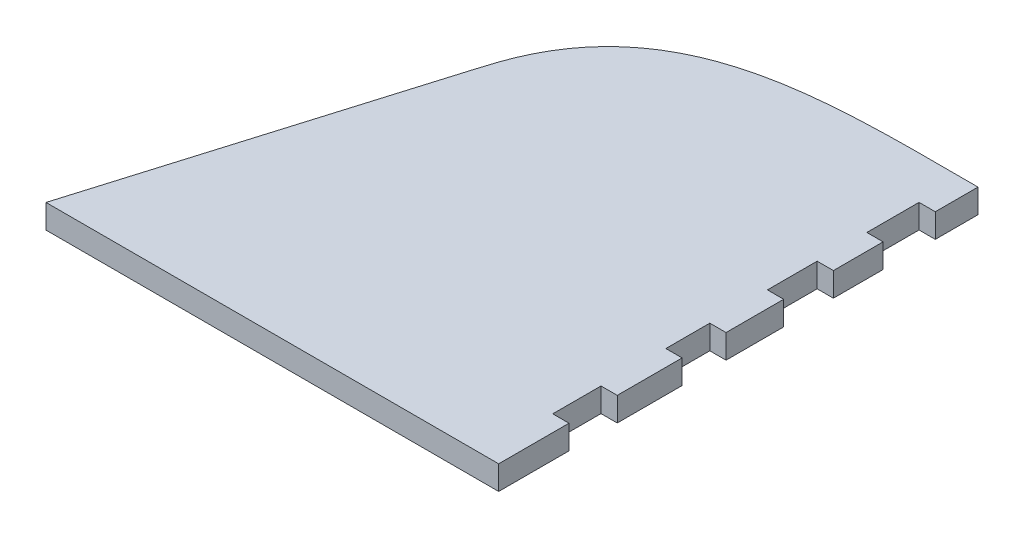
ISO-10303-21;
HEADER;
FILE_DESCRIPTION(('STEP AP214'),'2;1');
FILE_NAME('part.step','',(''),(''),'','','');
FILE_SCHEMA(('AUTOMOTIVE_DESIGN { 1 0 10303 214 1 1 1 1 }'));
ENDSEC;
DATA;
#1=APPLICATION_CONTEXT('core data for automotive mechanical design processes');
#2=APPLICATION_PROTOCOL_DEFINITION('international standard','automotive_design',2000,#1);
#3=PRODUCT_CONTEXT('',#1,'mechanical');
#4=PRODUCT('Part','Part','',(#3));
#5=PRODUCT_RELATED_PRODUCT_CATEGORY('part','',(#4));
#6=PRODUCT_DEFINITION_FORMATION('','',#4);
#7=PRODUCT_DEFINITION_CONTEXT('part definition',#1,'design');
#8=PRODUCT_DEFINITION('design','',#6,#7);
#9=PRODUCT_DEFINITION_SHAPE('','',#8);
#10=(LENGTH_UNIT() NAMED_UNIT(*) SI_UNIT(.MILLI.,.METRE.));
#11=(NAMED_UNIT(*) PLANE_ANGLE_UNIT() SI_UNIT($,.RADIAN.));
#12=(NAMED_UNIT(*) SI_UNIT($,.STERADIAN.) SOLID_ANGLE_UNIT());
#13=UNCERTAINTY_MEASURE_WITH_UNIT(LENGTH_MEASURE(1.E-05),#10,'distance_accuracy_value','');
#14=(GEOMETRIC_REPRESENTATION_CONTEXT(3) GLOBAL_UNCERTAINTY_ASSIGNED_CONTEXT((#13)) GLOBAL_UNIT_ASSIGNED_CONTEXT((#10,
#11,#12)) REPRESENTATION_CONTEXT('',''));
#15=CARTESIAN_POINT('',(0.,0.,0.));
#16=DIRECTION('',(0.,0.,1.));
#17=DIRECTION('',(1.,0.,0.));
#18=AXIS2_PLACEMENT_3D('',#15,#16,#17);
#19=CARTESIAN_POINT('',(107.95,5.715,-58.0476301724045));
#20=DIRECTION('',(1.,0.,0.));
#21=DIRECTION('',(0.,0.,-1.));
#22=AXIS2_PLACEMENT_3D('',#19,#20,#21);
#23=PLANE('',#22);
#24=DIRECTION('',(0.,0.,1.));
#25=VECTOR('',#24,1.);
#26=CARTESIAN_POINT('',(107.95,0.,-58.0476301724045));
#27=LINE('',#26,#25);
#28=CARTESIAN_POINT('',(107.95,0.,-114.3));
#29=VERTEX_POINT('',#28);
#30=CARTESIAN_POINT('',(107.95,0.,-104.11377720999));
#31=VERTEX_POINT('',#30);
#32=EDGE_CURVE('E204',#29,#31,#27,.T.);
#33=ORIENTED_EDGE('',*,*,#32,.F.);
#34=DIRECTION('',(0.,-1.,0.));
#35=VECTOR('',#34,1.);
#36=CARTESIAN_POINT('',(107.95,5.715,-114.3));
#37=LINE('',#36,#35);
#38=CARTESIAN_POINT('',(107.95,5.715,-114.3));
#39=VERTEX_POINT('',#38);
#40=EDGE_CURVE('E11',#39,#29,#37,.T.);
#41=ORIENTED_EDGE('',*,*,#40,.F.);
#42=DIRECTION('',(0.,0.,1.));
#43=VECTOR('',#42,1.);
#44=CARTESIAN_POINT('',(107.95,5.715,-58.0476301724045));
#45=LINE('',#44,#43);
#46=CARTESIAN_POINT('',(107.95,5.715,-104.11377720999));
#47=VERTEX_POINT('',#46);
#48=EDGE_CURVE('E260',#39,#47,#45,.T.);
#49=ORIENTED_EDGE('',*,*,#48,.T.);
#50=DIRECTION('',(0.,-1.,0.));
#51=VECTOR('',#50,1.);
#52=CARTESIAN_POINT('',(107.95,5.715,-104.11377720999));
#53=LINE('',#52,#51);
#54=EDGE_CURVE('E48',#47,#31,#53,.T.);
#55=ORIENTED_EDGE('',*,*,#54,.T.);
#56=EDGE_LOOP('',(#33,#41,#49,#55));
#57=FACE_BOUND('',#56,.T.);
#58=ADVANCED_FACE('F31',(#57),#23,.T.);
#59=CARTESIAN_POINT('',(-69.4727218626998,5.715,-114.3));
#60=DIRECTION('',(0.,0.,1.));
#61=DIRECTION('',(1.,0.,0.));
#62=AXIS2_PLACEMENT_3D('',#59,#60,#61);
#63=PLANE('',#62);
#64=DIRECTION('',(-1.,0.,0.));
#65=VECTOR('',#64,1.);
#66=CARTESIAN_POINT('',(-69.4727218626998,0.,-114.3));
#67=LINE('',#66,#65);
#68=CARTESIAN_POINT('',(92.7826361666683,0.,-114.299999999371));
#69=VERTEX_POINT('',#68);
#70=EDGE_CURVE('E206',#29,#69,#67,.T.);
#71=ORIENTED_EDGE('',*,*,#70,.T.);
#72=DIRECTION('',(0.,-1.,0.));
#73=VECTOR('',#72,1.);
#74=CARTESIAN_POINT('',(92.7826361666683,5.715,-114.299999999371));
#75=LINE('',#74,#73);
#76=CARTESIAN_POINT('',(92.7826361666683,5.715,-114.299999999371));
#77=VERTEX_POINT('',#76);
#78=EDGE_CURVE('E40',#77,#69,#75,.T.);
#79=ORIENTED_EDGE('',*,*,#78,.F.);
#80=DIRECTION('',(-1.,0.,0.));
#81=VECTOR('',#80,1.);
#82=CARTESIAN_POINT('',(-69.4727218626998,5.715,-114.3));
#83=LINE('',#82,#81);
#84=EDGE_CURVE('E313',#39,#77,#83,.T.);
#85=ORIENTED_EDGE('',*,*,#84,.F.);
#86=ORIENTED_EDGE('',*,*,#40,.T.);
#87=EDGE_LOOP('',(#71,#79,#85,#86));
#88=FACE_BOUND('',#87,.T.);
#89=ADVANCED_FACE('F33',(#88),#63,.F.);
#90=CARTESIAN_POINT('',(23.4349790662292,5.715,-78.1098682285532));
#91=CARTESIAN_POINT('',(23.9776742706804,5.715,-79.9186964245654));
#92=CARTESIAN_POINT('',(34.8315783597042,5.715,-116.095260344809));
#93=CARTESIAN_POINT('',(72.2088154419437,5.715,-114.3));
#94=CARTESIAN_POINT('',(107.95,5.715,-114.3));
#95=B_SPLINE_CURVE_WITH_KNOTS('',3,(#90,#91,#92,#93,#94),.UNSPECIFIED.,.F.,.F.,(4,1,4),(0.,
0.0499999999999999,1.),.UNSPECIFIED.);
#96=DIRECTION('',(0.,-1.,0.));
#97=VECTOR('',#96,1.);
#98=SURFACE_OF_LINEAR_EXTRUSION('',#95,#97);
#99=CARTESIAN_POINT('',(23.4349790662292,0.,-78.1098682285532));
#100=CARTESIAN_POINT('',(23.9776742706804,0.,-79.9186964245654));
#101=CARTESIAN_POINT('',(34.8315783597042,0.,-116.095260344809));
#102=CARTESIAN_POINT('',(72.2088154419437,0.,-114.3));
#103=CARTESIAN_POINT('',(107.95,0.,-114.3));
#104=B_SPLINE_CURVE_WITH_KNOTS('',3,(#99,#100,#101,#102,#103),.UNSPECIFIED.,.F.,.F.,(4,1,4),(0.,
0.0499999999999999,1.),.UNSPECIFIED.);
#105=CARTESIAN_POINT('',(23.4349790662293,0.,-78.1098682285532));
#106=VERTEX_POINT('',#105);
#107=EDGE_CURVE('E211',#106,#69,#104,.T.);
#108=ORIENTED_EDGE('',*,*,#107,.F.);
#109=DIRECTION('',(0.,-1.,0.));
#110=VECTOR('',#109,1.);
#111=CARTESIAN_POINT('',(23.4349790662293,5.715,-78.1098682285532));
#112=LINE('',#111,#110);
#113=CARTESIAN_POINT('',(23.4349790662293,5.715,-78.1098682285532));
#114=VERTEX_POINT('',#113);
#115=EDGE_CURVE('E292',#114,#106,#112,.T.);
#116=ORIENTED_EDGE('',*,*,#115,.F.);
#117=EDGE_CURVE('E299',#114,#77,#95,.T.);
#118=ORIENTED_EDGE('',*,*,#117,.T.);
#119=ORIENTED_EDGE('',*,*,#78,.T.);
#120=EDGE_LOOP('',(#108,#116,#118,#119));
#121=FACE_BOUND('',#120,.T.);
#122=ADVANCED_FACE('F297',(#121),#98,.T.);
#123=CARTESIAN_POINT('',(10.240374441272,5.715,-34.1316412512375));
#124=DIRECTION('',(-0.957819472204654,0.,-0.287370594643219));
#125=DIRECTION('',(-0.287370594643219,0.,0.957819472204655));
#126=AXIS2_PLACEMENT_3D('',#123,#124,#125);
#127=PLANE('',#126);
#128=DIRECTION('',(0.287370594643219,0.,-0.957819472204655));
#129=VECTOR('',#128,1.);
#130=CARTESIAN_POINT('',(10.240374441272,0.,-34.1316412512375));
#131=LINE('',#130,#129);
#132=CARTESIAN_POINT('',(0.,0.,0.));
#133=VERTEX_POINT('',#132);
#134=EDGE_CURVE('E216',#133,#106,#131,.T.);
#135=ORIENTED_EDGE('',*,*,#134,.F.);
#136=DIRECTION('',(0.,-1.,0.));
#137=VECTOR('',#136,1.);
#138=CARTESIAN_POINT('',(0.,5.715,0.));
#139=LINE('',#138,#137);
#140=CARTESIAN_POINT('',(0.,5.715,0.));
#141=VERTEX_POINT('',#140);
#142=EDGE_CURVE('E290',#141,#133,#139,.T.);
#143=ORIENTED_EDGE('',*,*,#142,.F.);
#144=DIRECTION('',(0.287370594643219,0.,-0.957819472204655));
#145=VECTOR('',#144,1.);
#146=CARTESIAN_POINT('',(10.240374441272,5.715,-34.1316412512375));
#147=LINE('',#146,#145);
#148=EDGE_CURVE('E312',#141,#114,#147,.T.);
#149=ORIENTED_EDGE('',*,*,#148,.T.);
#150=ORIENTED_EDGE('',*,*,#115,.T.);
#151=EDGE_LOOP('',(#135,#143,#149,#150));
#152=FACE_BOUND('',#151,.T.);
#153=ADVANCED_FACE('F308',(#152),#127,.T.);
#154=CARTESIAN_POINT('',(-69.4727218626998,5.715,0.));
#155=DIRECTION('',(0.,0.,-1.));
#156=DIRECTION('',(-1.,0.,0.));
#157=AXIS2_PLACEMENT_3D('',#154,#155,#156);
#158=PLANE('',#157);
#159=DIRECTION('',(1.,0.,0.));
#160=VECTOR('',#159,1.);
#161=CARTESIAN_POINT('',(-69.4727218626998,0.,0.));
#162=LINE('',#161,#160);
#163=CARTESIAN_POINT('',(107.95,0.,0.));
#164=VERTEX_POINT('',#163);
#165=EDGE_CURVE('E222',#133,#164,#162,.T.);
#166=ORIENTED_EDGE('',*,*,#165,.T.);
#167=DIRECTION('',(0.,-1.,0.));
#168=VECTOR('',#167,1.);
#169=CARTESIAN_POINT('',(107.95,5.715,0.));
#170=LINE('',#169,#168);
#171=CARTESIAN_POINT('',(107.95,5.715,0.));
#172=VERTEX_POINT('',#171);
#173=EDGE_CURVE('E288',#172,#164,#170,.T.);
#174=ORIENTED_EDGE('',*,*,#173,.F.);
#175=DIRECTION('',(1.,0.,0.));
#176=VECTOR('',#175,1.);
#177=CARTESIAN_POINT('',(-69.4727218626998,5.715,0.));
#178=LINE('',#177,#176);
#179=EDGE_CURVE('E315',#141,#172,#178,.T.);
#180=ORIENTED_EDGE('',*,*,#179,.F.);
#181=ORIENTED_EDGE('',*,*,#142,.T.);
#182=EDGE_LOOP('',(#166,#174,#180,#181));
#183=FACE_BOUND('',#182,.T.);
#184=ADVANCED_FACE('F330',(#183),#158,.F.);
#185=CARTESIAN_POINT('',(107.95,0.,-16.7636241274894));
#186=VERTEX_POINT('',#185);
#187=EDGE_CURVE('E208',#186,#164,#27,.T.);
#188=ORIENTED_EDGE('',*,*,#187,.F.);
#189=DIRECTION('',(0.,-1.,0.));
#190=VECTOR('',#189,1.);
#191=CARTESIAN_POINT('',(107.95,5.715,-16.7636241274894));
#192=LINE('',#191,#190);
#193=CARTESIAN_POINT('',(107.95,5.715,-16.7636241274894));
#194=VERTEX_POINT('',#193);
#195=EDGE_CURVE('E286',#194,#186,#192,.T.);
#196=ORIENTED_EDGE('',*,*,#195,.F.);
#197=EDGE_CURVE('E438',#194,#172,#45,.T.);
#198=ORIENTED_EDGE('',*,*,#197,.T.);
#199=ORIENTED_EDGE('',*,*,#173,.T.);
#200=EDGE_LOOP('',(#188,#196,#198,#199));
#201=FACE_BOUND('',#200,.T.);
#202=ADVANCED_FACE('F333',(#201),#23,.T.);
#203=CARTESIAN_POINT('',(-69.4727218626998,5.715,-16.7636241274894));
#204=DIRECTION('',(0.,0.,1.));
#205=DIRECTION('',(1.,0.,0.));
#206=AXIS2_PLACEMENT_3D('',#203,#204,#205);
#207=PLANE('',#206);
#208=DIRECTION('',(-1.,0.,0.));
#209=VECTOR('',#208,1.);
#210=CARTESIAN_POINT('',(-69.4727218626998,0.,-16.7636241274894));
#211=LINE('',#210,#209);
#212=CARTESIAN_POINT('',(104.075854957914,0.,-16.7636241274894));
#213=VERTEX_POINT('',#212);
#214=EDGE_CURVE('E225',#186,#213,#211,.T.);
#215=ORIENTED_EDGE('',*,*,#214,.T.);
#216=DIRECTION('',(0.,-1.,0.));
#217=VECTOR('',#216,1.);
#218=CARTESIAN_POINT('',(104.075854957914,5.715,-16.7636241274894));
#219=LINE('',#218,#217);
#220=CARTESIAN_POINT('',(104.075854957914,5.715,-16.7636241274894));
#221=VERTEX_POINT('',#220);
#222=EDGE_CURVE('E284',#221,#213,#219,.T.);
#223=ORIENTED_EDGE('',*,*,#222,.F.);
#224=DIRECTION('',(-1.,0.,0.));
#225=VECTOR('',#224,1.);
#226=CARTESIAN_POINT('',(-69.4727218626998,5.715,-16.7636241274894));
#227=LINE('',#226,#225);
#228=EDGE_CURVE('E440',#194,#221,#227,.T.);
#229=ORIENTED_EDGE('',*,*,#228,.F.);
#230=ORIENTED_EDGE('',*,*,#195,.T.);
#231=EDGE_LOOP('',(#215,#223,#229,#230));
#232=FACE_BOUND('',#231,.T.);
#233=ADVANCED_FACE('F335',(#232),#207,.F.);
#234=CARTESIAN_POINT('',(104.075854957914,5.715,-58.0476301724045));
#235=DIRECTION('',(1.,0.,0.));
#236=DIRECTION('',(0.,0.,-1.));
#237=AXIS2_PLACEMENT_3D('',#234,#235,#236);
#238=PLANE('',#237);
#239=DIRECTION('',(0.,0.,1.));
#240=VECTOR('',#239,1.);
#241=CARTESIAN_POINT('',(104.075854957914,0.,-58.0476301724045));
#242=LINE('',#241,#240);
#243=CARTESIAN_POINT('',(104.075854957914,0.,-28.2745352421934));
#244=VERTEX_POINT('',#243);
#245=EDGE_CURVE('E228',#244,#213,#242,.T.);
#246=ORIENTED_EDGE('',*,*,#245,.F.);
#247=DIRECTION('',(0.,-1.,0.));
#248=VECTOR('',#247,1.);
#249=CARTESIAN_POINT('',(104.075854957914,5.715,-28.2745352421934));
#250=LINE('',#249,#248);
#251=CARTESIAN_POINT('',(104.075854957914,5.715,-28.2745352421934));
#252=VERTEX_POINT('',#251);
#253=EDGE_CURVE('E282',#252,#244,#250,.T.);
#254=ORIENTED_EDGE('',*,*,#253,.F.);
#255=DIRECTION('',(0.,0.,1.));
#256=VECTOR('',#255,1.);
#257=CARTESIAN_POINT('',(104.075854957914,5.715,-58.0476301724045));
#258=LINE('',#257,#256);
#259=EDGE_CURVE('E442',#252,#221,#258,.T.);
#260=ORIENTED_EDGE('',*,*,#259,.T.);
#261=ORIENTED_EDGE('',*,*,#222,.T.);
#262=EDGE_LOOP('',(#246,#254,#260,#261));
#263=FACE_BOUND('',#262,.T.);
#264=ADVANCED_FACE('F338',(#263),#238,.T.);
#265=CARTESIAN_POINT('',(-69.4727218626998,5.715,-28.2745352421934));
#266=DIRECTION('',(0.,0.,1.));
#267=DIRECTION('',(1.,0.,0.));
#268=AXIS2_PLACEMENT_3D('',#265,#266,#267);
#269=PLANE('',#268);
#270=DIRECTION('',(-1.,0.,0.));
#271=VECTOR('',#270,1.);
#272=CARTESIAN_POINT('',(-69.4727218626998,0.,-28.2745352421934));
#273=LINE('',#272,#271);
#274=CARTESIAN_POINT('',(107.95,0.,-28.2745352421934));
#275=VERTEX_POINT('',#274);
#276=EDGE_CURVE('E231',#275,#244,#273,.T.);
#277=ORIENTED_EDGE('',*,*,#276,.F.);
#278=DIRECTION('',(0.,-1.,0.));
#279=VECTOR('',#278,1.);
#280=CARTESIAN_POINT('',(107.95,5.715,-28.2745352421934));
#281=LINE('',#280,#279);
#282=CARTESIAN_POINT('',(107.95,5.715,-28.2745352421934));
#283=VERTEX_POINT('',#282);
#284=EDGE_CURVE('E280',#283,#275,#281,.T.);
#285=ORIENTED_EDGE('',*,*,#284,.F.);
#286=DIRECTION('',(-1.,0.,0.));
#287=VECTOR('',#286,1.);
#288=CARTESIAN_POINT('',(-69.4727218626998,5.715,-28.2745352421934));
#289=LINE('',#288,#287);
#290=EDGE_CURVE('E437',#283,#252,#289,.T.);
#291=ORIENTED_EDGE('',*,*,#290,.T.);
#292=ORIENTED_EDGE('',*,*,#253,.T.);
#293=EDGE_LOOP('',(#277,#285,#291,#292));
#294=FACE_BOUND('',#293,.T.);
#295=ADVANCED_FACE('F342',(#294),#269,.T.);
#296=CARTESIAN_POINT('',(107.95,0.,-43.7369531574674));
#297=VERTEX_POINT('',#296);
#298=EDGE_CURVE('E234',#297,#275,#27,.T.);
#299=ORIENTED_EDGE('',*,*,#298,.F.);
#300=DIRECTION('',(0.,-1.,0.));
#301=VECTOR('',#300,1.);
#302=CARTESIAN_POINT('',(107.95,5.715,-43.7369531574674));
#303=LINE('',#302,#301);
#304=CARTESIAN_POINT('',(107.95,5.715,-43.7369531574674));
#305=VERTEX_POINT('',#304);
#306=EDGE_CURVE('E278',#305,#297,#303,.T.);
#307=ORIENTED_EDGE('',*,*,#306,.F.);
#308=EDGE_CURVE('E432',#305,#283,#45,.T.);
#309=ORIENTED_EDGE('',*,*,#308,.T.);
#310=ORIENTED_EDGE('',*,*,#284,.T.);
#311=EDGE_LOOP('',(#299,#307,#309,#310));
#312=FACE_BOUND('',#311,.T.);
#313=ADVANCED_FACE('F346',(#312),#23,.T.);
#314=CARTESIAN_POINT('',(-69.4727218626998,5.715,-43.7369531574674));
#315=DIRECTION('',(0.,0.,1.));
#316=DIRECTION('',(1.,0.,0.));
#317=AXIS2_PLACEMENT_3D('',#314,#315,#316);
#318=PLANE('',#317);
#319=DIRECTION('',(-1.,0.,0.));
#320=VECTOR('',#319,1.);
#321=CARTESIAN_POINT('',(-69.4727218626998,0.,-43.7369531574674));
#322=LINE('',#321,#320);
#323=CARTESIAN_POINT('',(104.075854957914,0.,-43.7369531574674));
#324=VERTEX_POINT('',#323);
#325=EDGE_CURVE('E235',#297,#324,#322,.T.);
#326=ORIENTED_EDGE('',*,*,#325,.T.);
#327=DIRECTION('',(0.,-1.,0.));
#328=VECTOR('',#327,1.);
#329=CARTESIAN_POINT('',(104.075854957914,5.715,-43.7369531574674));
#330=LINE('',#329,#328);
#331=CARTESIAN_POINT('',(104.075854957914,5.715,-43.7369531574674));
#332=VERTEX_POINT('',#331);
#333=EDGE_CURVE('E276',#332,#324,#330,.T.);
#334=ORIENTED_EDGE('',*,*,#333,.F.);
#335=DIRECTION('',(-1.,0.,0.));
#336=VECTOR('',#335,1.);
#337=CARTESIAN_POINT('',(-69.4727218626998,5.715,-43.7369531574674));
#338=LINE('',#337,#336);
#339=EDGE_CURVE('E436',#305,#332,#338,.T.);
#340=ORIENTED_EDGE('',*,*,#339,.F.);
#341=ORIENTED_EDGE('',*,*,#306,.T.);
#342=EDGE_LOOP('',(#326,#334,#340,#341));
#343=FACE_BOUND('',#342,.T.);
#344=ADVANCED_FACE('F348',(#343),#318,.F.);
#345=CARTESIAN_POINT('',(104.075854957914,5.715,-58.0476301724045));
#346=DIRECTION('',(1.,0.,0.));
#347=DIRECTION('',(0.,0.,-1.));
#348=AXIS2_PLACEMENT_3D('',#345,#346,#347);
#349=PLANE('',#348);
#350=DIRECTION('',(0.,0.,1.));
#351=VECTOR('',#350,1.);
#352=CARTESIAN_POINT('',(104.075854957914,0.,-58.0476301724045));
#353=LINE('',#352,#351);
#354=CARTESIAN_POINT('',(104.075854957914,0.,-54.2170364111531));
#355=VERTEX_POINT('',#354);
#356=EDGE_CURVE('E238',#355,#324,#353,.T.);
#357=ORIENTED_EDGE('',*,*,#356,.F.);
#358=DIRECTION('',(0.,-1.,0.));
#359=VECTOR('',#358,1.);
#360=CARTESIAN_POINT('',(104.075854957914,5.715,-54.2170364111531));
#361=LINE('',#360,#359);
#362=CARTESIAN_POINT('',(104.075854957914,5.715,-54.2170364111531));
#363=VERTEX_POINT('',#362);
#364=EDGE_CURVE('E274',#363,#355,#361,.T.);
#365=ORIENTED_EDGE('',*,*,#364,.F.);
#366=DIRECTION('',(0.,0.,1.));
#367=VECTOR('',#366,1.);
#368=CARTESIAN_POINT('',(104.075854957914,5.715,-58.0476301724045));
#369=LINE('',#368,#367);
#370=EDGE_CURVE('E433',#363,#332,#369,.T.);
#371=ORIENTED_EDGE('',*,*,#370,.T.);
#372=ORIENTED_EDGE('',*,*,#333,.T.);
#373=EDGE_LOOP('',(#357,#365,#371,#372));
#374=FACE_BOUND('',#373,.T.);
#375=ADVANCED_FACE('F351',(#374),#349,.T.);
#376=CARTESIAN_POINT('',(-69.4727218626998,5.715,-54.2170364111531));
#377=DIRECTION('',(0.,0.,1.));
#378=DIRECTION('',(1.,0.,0.));
#379=AXIS2_PLACEMENT_3D('',#376,#377,#378);
#380=PLANE('',#379);
#381=DIRECTION('',(-1.,0.,0.));
#382=VECTOR('',#381,1.);
#383=CARTESIAN_POINT('',(-69.4727218626998,0.,-54.2170364111531));
#384=LINE('',#383,#382);
#385=CARTESIAN_POINT('',(107.95,0.,-54.2170364111531));
#386=VERTEX_POINT('',#385);
#387=EDGE_CURVE('E241',#386,#355,#384,.T.);
#388=ORIENTED_EDGE('',*,*,#387,.F.);
#389=DIRECTION('',(0.,-1.,0.));
#390=VECTOR('',#389,1.);
#391=CARTESIAN_POINT('',(107.95,5.715,-54.2170364111531));
#392=LINE('',#391,#390);
#393=CARTESIAN_POINT('',(107.95,5.715,-54.2170364111531));
#394=VERTEX_POINT('',#393);
#395=EDGE_CURVE('E272',#394,#386,#392,.T.);
#396=ORIENTED_EDGE('',*,*,#395,.F.);
#397=DIRECTION('',(-1.,0.,0.));
#398=VECTOR('',#397,1.);
#399=CARTESIAN_POINT('',(-69.4727218626998,5.715,-54.2170364111531));
#400=LINE('',#399,#398);
#401=EDGE_CURVE('E431',#394,#363,#400,.T.);
#402=ORIENTED_EDGE('',*,*,#401,.T.);
#403=ORIENTED_EDGE('',*,*,#364,.T.);
#404=EDGE_LOOP('',(#388,#396,#402,#403));
#405=FACE_BOUND('',#404,.T.);
#406=ADVANCED_FACE('F355',(#405),#380,.T.);
#407=CARTESIAN_POINT('',(107.95,0.,-67.9614078913966));
#408=VERTEX_POINT('',#407);
#409=EDGE_CURVE('E244',#408,#386,#27,.T.);
#410=ORIENTED_EDGE('',*,*,#409,.F.);
#411=DIRECTION('',(0.,-1.,0.));
#412=VECTOR('',#411,1.);
#413=CARTESIAN_POINT('',(107.95,5.715,-67.9614078913966));
#414=LINE('',#413,#412);
#415=CARTESIAN_POINT('',(107.95,5.715,-67.9614078913966));
#416=VERTEX_POINT('',#415);
#417=EDGE_CURVE('E270',#416,#408,#414,.T.);
#418=ORIENTED_EDGE('',*,*,#417,.F.);
#419=EDGE_CURVE('E426',#416,#394,#45,.T.);
#420=ORIENTED_EDGE('',*,*,#419,.T.);
#421=ORIENTED_EDGE('',*,*,#395,.T.);
#422=EDGE_LOOP('',(#410,#418,#420,#421));
#423=FACE_BOUND('',#422,.T.);
#424=ADVANCED_FACE('F359',(#423),#23,.T.);
#425=CARTESIAN_POINT('',(-69.4727218626998,5.715,-67.9614078913966));
#426=DIRECTION('',(0.,0.,1.));
#427=DIRECTION('',(1.,0.,0.));
#428=AXIS2_PLACEMENT_3D('',#425,#426,#427);
#429=PLANE('',#428);
#430=DIRECTION('',(-1.,0.,0.));
#431=VECTOR('',#430,1.);
#432=CARTESIAN_POINT('',(-69.4727218626998,0.,-67.9614078913966));
#433=LINE('',#432,#431);
#434=CARTESIAN_POINT('',(104.075854957914,0.,-67.9614078913966));
#435=VERTEX_POINT('',#434);
#436=EDGE_CURVE('E245',#408,#435,#433,.T.);
#437=ORIENTED_EDGE('',*,*,#436,.T.);
#438=DIRECTION('',(0.,-1.,0.));
#439=VECTOR('',#438,1.);
#440=CARTESIAN_POINT('',(104.075854957914,5.715,-67.9614078913966));
#441=LINE('',#440,#439);
#442=CARTESIAN_POINT('',(104.075854957914,5.715,-67.9614078913966));
#443=VERTEX_POINT('',#442);
#444=EDGE_CURVE('E268',#443,#435,#441,.T.);
#445=ORIENTED_EDGE('',*,*,#444,.F.);
#446=DIRECTION('',(-1.,0.,0.));
#447=VECTOR('',#446,1.);
#448=CARTESIAN_POINT('',(-69.4727218626998,5.715,-67.9614078913966));
#449=LINE('',#448,#447);
#450=EDGE_CURVE('E423',#416,#443,#449,.T.);
#451=ORIENTED_EDGE('',*,*,#450,.F.);
#452=ORIENTED_EDGE('',*,*,#417,.T.);
#453=EDGE_LOOP('',(#437,#445,#451,#452));
#454=FACE_BOUND('',#453,.T.);
#455=ADVANCED_FACE('F361',(#454),#429,.F.);
#456=CARTESIAN_POINT('',(104.075854957914,5.715,-58.0476301724045));
#457=DIRECTION('',(1.,0.,0.));
#458=DIRECTION('',(0.,0.,-1.));
#459=AXIS2_PLACEMENT_3D('',#456,#457,#458);
#460=PLANE('',#459);
#461=DIRECTION('',(0.,0.,1.));
#462=VECTOR('',#461,1.);
#463=CARTESIAN_POINT('',(104.075854957914,0.,-58.0476301724045));
#464=LINE('',#463,#462);
#465=CARTESIAN_POINT('',(104.075854957914,0.,-79.8159282931067));
#466=VERTEX_POINT('',#465);
#467=EDGE_CURVE('E248',#466,#435,#464,.T.);
#468=ORIENTED_EDGE('',*,*,#467,.F.);
#469=DIRECTION('',(0.,-1.,0.));
#470=VECTOR('',#469,1.);
#471=CARTESIAN_POINT('',(104.075854957914,5.715,-79.8159282931067));
#472=LINE('',#471,#470);
#473=CARTESIAN_POINT('',(104.075854957914,5.715,-79.8159282931067));
#474=VERTEX_POINT('',#473);
#475=EDGE_CURVE('E266',#474,#466,#472,.T.);
#476=ORIENTED_EDGE('',*,*,#475,.F.);
#477=DIRECTION('',(0.,0.,1.));
#478=VECTOR('',#477,1.);
#479=CARTESIAN_POINT('',(104.075854957914,5.715,-58.0476301724045));
#480=LINE('',#479,#478);
#481=EDGE_CURVE('E425',#474,#443,#480,.T.);
#482=ORIENTED_EDGE('',*,*,#481,.T.);
#483=ORIENTED_EDGE('',*,*,#444,.T.);
#484=EDGE_LOOP('',(#468,#476,#482,#483));
#485=FACE_BOUND('',#484,.T.);
#486=ADVANCED_FACE('F364',(#485),#460,.T.);
#487=CARTESIAN_POINT('',(-69.4727218626998,5.715,-79.8159282931067));
#488=DIRECTION('',(0.,0.,1.));
#489=DIRECTION('',(1.,0.,0.));
#490=AXIS2_PLACEMENT_3D('',#487,#488,#489);
#491=PLANE('',#490);
#492=DIRECTION('',(-1.,0.,0.));
#493=VECTOR('',#492,1.);
#494=CARTESIAN_POINT('',(-69.4727218626998,0.,-79.8159282931067));
#495=LINE('',#494,#493);
#496=CARTESIAN_POINT('',(107.95,0.,-79.8159282931067));
#497=VERTEX_POINT('',#496);
#498=EDGE_CURVE('E251',#497,#466,#495,.T.);
#499=ORIENTED_EDGE('',*,*,#498,.F.);
#500=DIRECTION('',(0.,-1.,0.));
#501=VECTOR('',#500,1.);
#502=CARTESIAN_POINT('',(107.95,5.715,-79.8159282931067));
#503=LINE('',#502,#501);
#504=CARTESIAN_POINT('',(107.95,5.715,-79.8159282931067));
#505=VERTEX_POINT('',#504);
#506=EDGE_CURVE('E264',#505,#497,#503,.T.);
#507=ORIENTED_EDGE('',*,*,#506,.F.);
#508=DIRECTION('',(-1.,0.,0.));
#509=VECTOR('',#508,1.);
#510=CARTESIAN_POINT('',(-69.4727218626998,5.715,-79.8159282931067));
#511=LINE('',#510,#509);
#512=EDGE_CURVE('E419',#505,#474,#511,.T.);
#513=ORIENTED_EDGE('',*,*,#512,.T.);
#514=ORIENTED_EDGE('',*,*,#475,.T.);
#515=EDGE_LOOP('',(#499,#507,#513,#514));
#516=FACE_BOUND('',#515,.T.);
#517=ADVANCED_FACE('F368',(#516),#491,.T.);
#518=CARTESIAN_POINT('',(107.95,0.,-91.6704486948167));
#519=VERTEX_POINT('',#518);
#520=EDGE_CURVE('E207',#519,#497,#27,.T.);
#521=ORIENTED_EDGE('',*,*,#520,.F.);
#522=DIRECTION('',(0.,-1.,0.));
#523=VECTOR('',#522,1.);
#524=CARTESIAN_POINT('',(107.95,5.715,-91.6704486948167));
#525=LINE('',#524,#523);
#526=CARTESIAN_POINT('',(107.95,5.715,-91.6704486948167));
#527=VERTEX_POINT('',#526);
#528=EDGE_CURVE('E196',#527,#519,#525,.T.);
#529=ORIENTED_EDGE('',*,*,#528,.F.);
#530=EDGE_CURVE('E186',#527,#505,#45,.T.);
#531=ORIENTED_EDGE('',*,*,#530,.T.);
#532=ORIENTED_EDGE('',*,*,#506,.T.);
#533=EDGE_LOOP('',(#521,#529,#531,#532));
#534=FACE_BOUND('',#533,.T.);
#535=ADVANCED_FACE('F372',(#534),#23,.T.);
#536=CARTESIAN_POINT('',(-69.4727218626998,5.715,-91.6704486948167));
#537=DIRECTION('',(0.,0.,1.));
#538=DIRECTION('',(1.,0.,0.));
#539=AXIS2_PLACEMENT_3D('',#536,#537,#538);
#540=PLANE('',#539);
#541=DIRECTION('',(-1.,0.,0.));
#542=VECTOR('',#541,1.);
#543=CARTESIAN_POINT('',(-69.4727218626998,0.,-91.6704486948167));
#544=LINE('',#543,#542);
#545=CARTESIAN_POINT('',(104.075854957914,0.,-91.6704486948167));
#546=VERTEX_POINT('',#545);
#547=EDGE_CURVE('E193',#519,#546,#544,.T.);
#548=ORIENTED_EDGE('',*,*,#547,.T.);
#549=DIRECTION('',(0.,-1.,0.));
#550=VECTOR('',#549,1.);
#551=CARTESIAN_POINT('',(104.075854957914,5.715,-91.6704486948167));
#552=LINE('',#551,#550);
#553=CARTESIAN_POINT('',(104.075854957914,5.715,-91.6704486948167));
#554=VERTEX_POINT('',#553);
#555=EDGE_CURVE('E190',#554,#546,#552,.T.);
#556=ORIENTED_EDGE('',*,*,#555,.F.);
#557=DIRECTION('',(-1.,0.,0.));
#558=VECTOR('',#557,1.);
#559=CARTESIAN_POINT('',(-69.4727218626998,5.715,-91.6704486948167));
#560=LINE('',#559,#558);
#561=EDGE_CURVE('E177',#527,#554,#560,.T.);
#562=ORIENTED_EDGE('',*,*,#561,.F.);
#563=ORIENTED_EDGE('',*,*,#528,.T.);
#564=EDGE_LOOP('',(#548,#556,#562,#563));
#565=FACE_BOUND('',#564,.T.);
#566=ADVANCED_FACE('F191',(#565),#540,.F.);
#567=CARTESIAN_POINT('',(104.075854957914,5.715,-58.0476301724045));
#568=DIRECTION('',(1.,0.,0.));
#569=DIRECTION('',(0.,0.,-1.));
#570=AXIS2_PLACEMENT_3D('',#567,#568,#569);
#571=PLANE('',#570);
#572=DIRECTION('',(0.,0.,1.));
#573=VECTOR('',#572,1.);
#574=CARTESIAN_POINT('',(104.075854957914,0.,-58.0476301724045));
#575=LINE('',#574,#573);
#576=CARTESIAN_POINT('',(104.075854957914,0.,-104.11377720999));
#577=VERTEX_POINT('',#576);
#578=EDGE_CURVE('E255',#577,#546,#575,.T.);
#579=ORIENTED_EDGE('',*,*,#578,.F.);
#580=DIRECTION('',(0.,-1.,0.));
#581=VECTOR('',#580,1.);
#582=CARTESIAN_POINT('',(104.075854957914,5.715,-104.11377720999));
#583=LINE('',#582,#581);
#584=CARTESIAN_POINT('',(104.075854957914,5.715,-104.11377720999));
#585=VERTEX_POINT('',#584);
#586=EDGE_CURVE('E112',#585,#577,#583,.T.);
#587=ORIENTED_EDGE('',*,*,#586,.F.);
#588=DIRECTION('',(0.,0.,1.));
#589=VECTOR('',#588,1.);
#590=CARTESIAN_POINT('',(104.075854957914,5.715,-58.0476301724045));
#591=LINE('',#590,#589);
#592=EDGE_CURVE('E183',#585,#554,#591,.T.);
#593=ORIENTED_EDGE('',*,*,#592,.T.);
#594=ORIENTED_EDGE('',*,*,#555,.T.);
#595=EDGE_LOOP('',(#579,#587,#593,#594));
#596=FACE_BOUND('',#595,.T.);
#597=ADVANCED_FACE('F198',(#596),#571,.T.);
#598=CARTESIAN_POINT('',(-69.4727218626998,5.715,-104.11377720999));
#599=DIRECTION('',(0.,0.,1.));
#600=DIRECTION('',(1.,0.,0.));
#601=AXIS2_PLACEMENT_3D('',#598,#599,#600);
#602=PLANE('',#601);
#603=DIRECTION('',(-1.,0.,0.));
#604=VECTOR('',#603,1.);
#605=CARTESIAN_POINT('',(-69.4727218626998,0.,-104.11377720999));
#606=LINE('',#605,#604);
#607=EDGE_CURVE('E257',#31,#577,#606,.T.);
#608=ORIENTED_EDGE('',*,*,#607,.F.);
#609=ORIENTED_EDGE('',*,*,#54,.F.);
#610=DIRECTION('',(-1.,0.,0.));
#611=VECTOR('',#610,1.);
#612=CARTESIAN_POINT('',(-69.4727218626998,5.715,-104.11377720999));
#613=LINE('',#612,#611);
#614=EDGE_CURVE('E199',#47,#585,#613,.T.);
#615=ORIENTED_EDGE('',*,*,#614,.T.);
#616=ORIENTED_EDGE('',*,*,#586,.T.);
#617=EDGE_LOOP('',(#608,#609,#615,#616));
#618=FACE_BOUND('',#617,.T.);
#619=ADVANCED_FACE('F381',(#618),#602,.T.);
#620=CARTESIAN_POINT('',(-69.4727218626998,5.715,-58.0476301724045));
#621=DIRECTION('',(0.,1.,0.));
#622=DIRECTION('',(0.,0.,1.));
#623=AXIS2_PLACEMENT_3D('',#620,#621,#622);
#624=PLANE('',#623);
#625=ORIENTED_EDGE('',*,*,#48,.F.);
#626=ORIENTED_EDGE('',*,*,#84,.T.);
#627=ORIENTED_EDGE('',*,*,#117,.F.);
#628=ORIENTED_EDGE('',*,*,#148,.F.);
#629=ORIENTED_EDGE('',*,*,#179,.T.);
#630=ORIENTED_EDGE('',*,*,#197,.F.);
#631=ORIENTED_EDGE('',*,*,#228,.T.);
#632=ORIENTED_EDGE('',*,*,#259,.F.);
#633=ORIENTED_EDGE('',*,*,#290,.F.);
#634=ORIENTED_EDGE('',*,*,#308,.F.);
#635=ORIENTED_EDGE('',*,*,#339,.T.);
#636=ORIENTED_EDGE('',*,*,#370,.F.);
#637=ORIENTED_EDGE('',*,*,#401,.F.);
#638=ORIENTED_EDGE('',*,*,#419,.F.);
#639=ORIENTED_EDGE('',*,*,#450,.T.);
#640=ORIENTED_EDGE('',*,*,#481,.F.);
#641=ORIENTED_EDGE('',*,*,#512,.F.);
#642=ORIENTED_EDGE('',*,*,#530,.F.);
#643=ORIENTED_EDGE('',*,*,#561,.T.);
#644=ORIENTED_EDGE('',*,*,#592,.F.);
#645=ORIENTED_EDGE('',*,*,#614,.F.);
#646=EDGE_LOOP('',(#625,#626,#627,#628,#629,#630,#631,#632,#633,#634,#635,#636,#637,#638,#639,
#640,#641,#642,#643,#644,#645));
#647=FACE_BOUND('',#646,.T.);
#648=ADVANCED_FACE('F180',(#647),#624,.T.);
#649=CARTESIAN_POINT('',(-69.4727218626998,0.,-58.0476301724045));
#650=DIRECTION('',(0.,1.,0.));
#651=DIRECTION('',(0.,0.,1.));
#652=AXIS2_PLACEMENT_3D('',#649,#650,#651);
#653=PLANE('',#652);
#654=ORIENTED_EDGE('',*,*,#32,.T.);
#655=ORIENTED_EDGE('',*,*,#607,.T.);
#656=ORIENTED_EDGE('',*,*,#578,.T.);
#657=ORIENTED_EDGE('',*,*,#547,.F.);
#658=ORIENTED_EDGE('',*,*,#520,.T.);
#659=ORIENTED_EDGE('',*,*,#498,.T.);
#660=ORIENTED_EDGE('',*,*,#467,.T.);
#661=ORIENTED_EDGE('',*,*,#436,.F.);
#662=ORIENTED_EDGE('',*,*,#409,.T.);
#663=ORIENTED_EDGE('',*,*,#387,.T.);
#664=ORIENTED_EDGE('',*,*,#356,.T.);
#665=ORIENTED_EDGE('',*,*,#325,.F.);
#666=ORIENTED_EDGE('',*,*,#298,.T.);
#667=ORIENTED_EDGE('',*,*,#276,.T.);
#668=ORIENTED_EDGE('',*,*,#245,.T.);
#669=ORIENTED_EDGE('',*,*,#214,.F.);
#670=ORIENTED_EDGE('',*,*,#187,.T.);
#671=ORIENTED_EDGE('',*,*,#165,.F.);
#672=ORIENTED_EDGE('',*,*,#134,.T.);
#673=ORIENTED_EDGE('',*,*,#107,.T.);
#674=ORIENTED_EDGE('',*,*,#70,.F.);
#675=EDGE_LOOP('',(#654,#655,#656,#657,#658,#659,#660,#661,#662,#663,#664,#665,#666,#667,#668,
#669,#670,#671,#672,#673,#674));
#676=FACE_BOUND('',#675,.T.);
#677=ADVANCED_FACE('F303',(#676),#653,.F.);
#678=CLOSED_SHELL('',(#58,#89,#122,#153,#184,#202,#233,#264,#295,#313,#344,#375,#406,#424,#455,
#486,#517,#535,#566,#597,#619,#648,#677));
#679=MANIFOLD_SOLID_BREP('B2',#678);
#680=ADVANCED_BREP_SHAPE_REPRESENTATION('',(#18,#679),#14);
#681=SHAPE_DEFINITION_REPRESENTATION(#9,#680);
ENDSEC;
END-ISO-10303-21;
